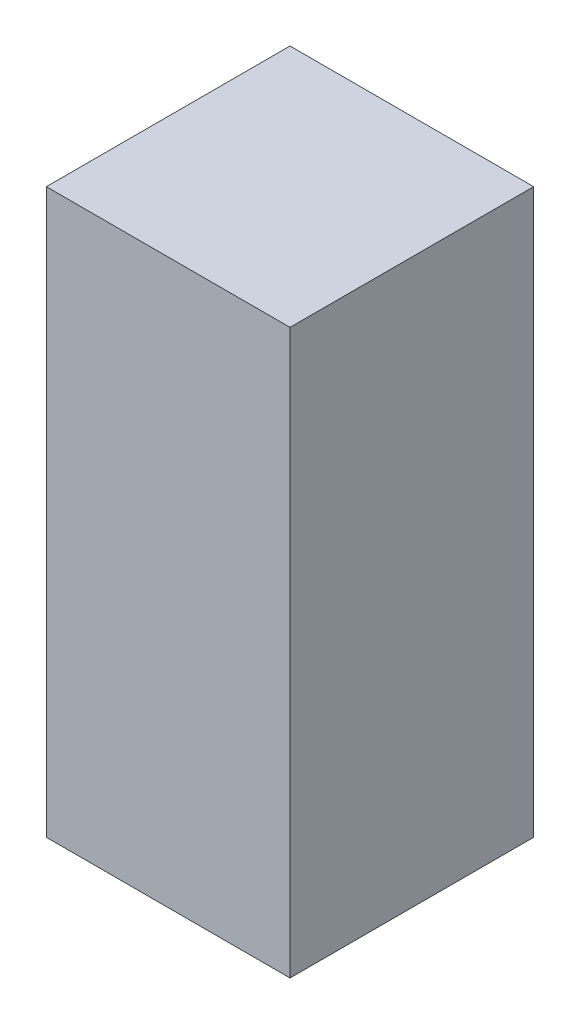
ISO-10303-21;
HEADER;
FILE_DESCRIPTION(('STEP AP214'),'2;1');
FILE_NAME('part.step','',(''),(''),'','','');
FILE_SCHEMA(('AUTOMOTIVE_DESIGN { 1 0 10303 214 1 1 1 1 }'));
ENDSEC;
DATA;
#1=APPLICATION_CONTEXT('core data for automotive mechanical design processes');
#2=APPLICATION_PROTOCOL_DEFINITION('international standard','automotive_design',2000,#1);
#3=PRODUCT_CONTEXT('',#1,'mechanical');
#4=PRODUCT('Part','Part','',(#3));
#5=PRODUCT_RELATED_PRODUCT_CATEGORY('part','',(#4));
#6=PRODUCT_DEFINITION_FORMATION('','',#4);
#7=PRODUCT_DEFINITION_CONTEXT('part definition',#1,'design');
#8=PRODUCT_DEFINITION('design','',#6,#7);
#9=PRODUCT_DEFINITION_SHAPE('','',#8);
#10=(LENGTH_UNIT() NAMED_UNIT(*) SI_UNIT(.MILLI.,.METRE.));
#11=(NAMED_UNIT(*) PLANE_ANGLE_UNIT() SI_UNIT($,.RADIAN.));
#12=(NAMED_UNIT(*) SI_UNIT($,.STERADIAN.) SOLID_ANGLE_UNIT());
#13=UNCERTAINTY_MEASURE_WITH_UNIT(LENGTH_MEASURE(1.E-05),#10,'distance_accuracy_value','');
#14=(GEOMETRIC_REPRESENTATION_CONTEXT(3) GLOBAL_UNCERTAINTY_ASSIGNED_CONTEXT((#13)) GLOBAL_UNIT_ASSIGNED_CONTEXT((#10,
#11,#12)) REPRESENTATION_CONTEXT('',''));
#15=CARTESIAN_POINT('',(0.,0.,0.));
#16=DIRECTION('',(0.,0.,1.));
#17=DIRECTION('',(1.,0.,0.));
#18=AXIS2_PLACEMENT_3D('',#15,#16,#17);
#19=CARTESIAN_POINT('',(-40.,-48.5,-68.));
#20=DIRECTION('',(-1.,0.,0.));
#21=DIRECTION('',(0.,-1.,0.));
#22=AXIS2_PLACEMENT_3D('',#19,#20,#21);
#23=PLANE('',#22);
#24=DIRECTION('',(0.,-1.,0.));
#25=VECTOR('',#24,1.);
#26=CARTESIAN_POINT('',(-40.,-48.5,12.));
#27=LINE('',#26,#25);
#28=CARTESIAN_POINT('',(-40.,136.5,12.));
#29=VERTEX_POINT('',#28);
#30=CARTESIAN_POINT('',(-40.,-48.5,12.));
#31=VERTEX_POINT('',#30);
#32=EDGE_CURVE('E101',#29,#31,#27,.T.);
#33=ORIENTED_EDGE('',*,*,#32,.F.);
#34=DIRECTION('',(0.,0.,1.));
#35=VECTOR('',#34,1.);
#36=CARTESIAN_POINT('',(-40.,136.5,-68.));
#37=LINE('',#36,#35);
#38=CARTESIAN_POINT('',(-40.,136.5,-68.));
#39=VERTEX_POINT('',#38);
#40=EDGE_CURVE('E11',#39,#29,#37,.T.);
#41=ORIENTED_EDGE('',*,*,#40,.F.);
#42=DIRECTION('',(0.,-1.,0.));
#43=VECTOR('',#42,1.);
#44=CARTESIAN_POINT('',(-40.,-48.5,-68.));
#45=LINE('',#44,#43);
#46=CARTESIAN_POINT('',(-40.,-48.5,-68.));
#47=VERTEX_POINT('',#46);
#48=EDGE_CURVE('E95',#39,#47,#45,.T.);
#49=ORIENTED_EDGE('',*,*,#48,.T.);
#50=DIRECTION('',(0.,0.,1.));
#51=VECTOR('',#50,1.);
#52=CARTESIAN_POINT('',(-40.,-48.5,-68.));
#53=LINE('',#52,#51);
#54=EDGE_CURVE('E40',#47,#31,#53,.T.);
#55=ORIENTED_EDGE('',*,*,#54,.T.);
#56=EDGE_LOOP('',(#33,#41,#49,#55));
#57=FACE_BOUND('',#56,.T.);
#58=ADVANCED_FACE('F37',(#57),#23,.T.);
#59=CARTESIAN_POINT('',(40.,136.5,-68.));
#60=DIRECTION('',(0.,1.,0.));
#61=DIRECTION('',(0.,0.,1.));
#62=AXIS2_PLACEMENT_3D('',#59,#60,#61);
#63=PLANE('',#62);
#64=DIRECTION('',(-1.,0.,0.));
#65=VECTOR('',#64,1.);
#66=CARTESIAN_POINT('',(40.,136.5,12.));
#67=LINE('',#66,#65);
#68=CARTESIAN_POINT('',(40.,136.5,12.));
#69=VERTEX_POINT('',#68);
#70=EDGE_CURVE('E97',#69,#29,#67,.T.);
#71=ORIENTED_EDGE('',*,*,#70,.F.);
#72=DIRECTION('',(0.,0.,1.));
#73=VECTOR('',#72,1.);
#74=CARTESIAN_POINT('',(40.,136.5,-68.));
#75=LINE('',#74,#73);
#76=CARTESIAN_POINT('',(40.,136.5,-68.));
#77=VERTEX_POINT('',#76);
#78=EDGE_CURVE('E46',#77,#69,#75,.T.);
#79=ORIENTED_EDGE('',*,*,#78,.F.);
#80=DIRECTION('',(-1.,0.,0.));
#81=VECTOR('',#80,1.);
#82=CARTESIAN_POINT('',(40.,136.5,-68.));
#83=LINE('',#82,#81);
#84=EDGE_CURVE('E92',#77,#39,#83,.T.);
#85=ORIENTED_EDGE('',*,*,#84,.T.);
#86=ORIENTED_EDGE('',*,*,#40,.T.);
#87=EDGE_LOOP('',(#71,#79,#85,#86));
#88=FACE_BOUND('',#87,.T.);
#89=ADVANCED_FACE('F111',(#88),#63,.T.);
#90=CARTESIAN_POINT('',(40.,-48.5,-68.));
#91=DIRECTION('',(1.,0.,0.));
#92=DIRECTION('',(0.,1.,0.));
#93=AXIS2_PLACEMENT_3D('',#90,#91,#92);
#94=PLANE('',#93);
#95=DIRECTION('',(0.,1.,0.));
#96=VECTOR('',#95,1.);
#97=CARTESIAN_POINT('',(40.,-48.5,12.));
#98=LINE('',#97,#96);
#99=CARTESIAN_POINT('',(40.,-48.5,12.));
#100=VERTEX_POINT('',#99);
#101=EDGE_CURVE('E87',#100,#69,#98,.T.);
#102=ORIENTED_EDGE('',*,*,#101,.F.);
#103=DIRECTION('',(0.,0.,1.));
#104=VECTOR('',#103,1.);
#105=CARTESIAN_POINT('',(40.,-48.5,-68.));
#106=LINE('',#105,#104);
#107=CARTESIAN_POINT('',(40.,-48.5,-68.));
#108=VERTEX_POINT('',#107);
#109=EDGE_CURVE('E82',#108,#100,#106,.T.);
#110=ORIENTED_EDGE('',*,*,#109,.F.);
#111=DIRECTION('',(0.,1.,0.));
#112=VECTOR('',#111,1.);
#113=CARTESIAN_POINT('',(40.,-48.5,-68.));
#114=LINE('',#113,#112);
#115=EDGE_CURVE('E85',#108,#77,#114,.T.);
#116=ORIENTED_EDGE('',*,*,#115,.T.);
#117=ORIENTED_EDGE('',*,*,#78,.T.);
#118=EDGE_LOOP('',(#102,#110,#116,#117));
#119=FACE_BOUND('',#118,.T.);
#120=ADVANCED_FACE('F84',(#119),#94,.T.);
#121=CARTESIAN_POINT('',(40.,-48.5,-68.));
#122=DIRECTION('',(0.,-1.,0.));
#123=DIRECTION('',(1.,0.,0.));
#124=AXIS2_PLACEMENT_3D('',#121,#122,#123);
#125=PLANE('',#124);
#126=DIRECTION('',(1.,0.,0.));
#127=VECTOR('',#126,1.);
#128=CARTESIAN_POINT('',(40.,-48.5,12.));
#129=LINE('',#128,#127);
#130=EDGE_CURVE('E104',#31,#100,#129,.T.);
#131=ORIENTED_EDGE('',*,*,#130,.F.);
#132=ORIENTED_EDGE('',*,*,#54,.F.);
#133=DIRECTION('',(1.,0.,0.));
#134=VECTOR('',#133,1.);
#135=CARTESIAN_POINT('',(40.,-48.5,-68.));
#136=LINE('',#135,#134);
#137=EDGE_CURVE('E91',#47,#108,#136,.T.);
#138=ORIENTED_EDGE('',*,*,#137,.T.);
#139=ORIENTED_EDGE('',*,*,#109,.T.);
#140=EDGE_LOOP('',(#131,#132,#138,#139));
#141=FACE_BOUND('',#140,.T.);
#142=ADVANCED_FACE('F94',(#141),#125,.T.);
#143=CARTESIAN_POINT('',(0.,0.,-68.));
#144=DIRECTION('',(0.,0.,1.));
#145=DIRECTION('',(1.,0.,0.));
#146=AXIS2_PLACEMENT_3D('',#143,#144,#145);
#147=PLANE('',#146);
#148=ORIENTED_EDGE('',*,*,#48,.F.);
#149=ORIENTED_EDGE('',*,*,#84,.F.);
#150=ORIENTED_EDGE('',*,*,#115,.F.);
#151=ORIENTED_EDGE('',*,*,#137,.F.);
#152=EDGE_LOOP('',(#148,#149,#150,#151));
#153=FACE_BOUND('',#152,.T.);
#154=ADVANCED_FACE('F90',(#153),#147,.F.);
#155=CARTESIAN_POINT('',(0.,0.,12.));
#156=DIRECTION('',(0.,0.,1.));
#157=DIRECTION('',(1.,0.,0.));
#158=AXIS2_PLACEMENT_3D('',#155,#156,#157);
#159=PLANE('',#158);
#160=ORIENTED_EDGE('',*,*,#32,.T.);
#161=ORIENTED_EDGE('',*,*,#130,.T.);
#162=ORIENTED_EDGE('',*,*,#101,.T.);
#163=ORIENTED_EDGE('',*,*,#70,.T.);
#164=EDGE_LOOP('',(#160,#161,#162,#163));
#165=FACE_BOUND('',#164,.T.);
#166=ADVANCED_FACE('F110',(#165),#159,.T.);
#167=CLOSED_SHELL('',(#58,#89,#120,#142,#154,#166));
#168=MANIFOLD_SOLID_BREP('B2',#167);
#169=ADVANCED_BREP_SHAPE_REPRESENTATION('',(#18,#168),#14);
#170=SHAPE_DEFINITION_REPRESENTATION(#9,#169);
ENDSEC;
END-ISO-10303-21;
